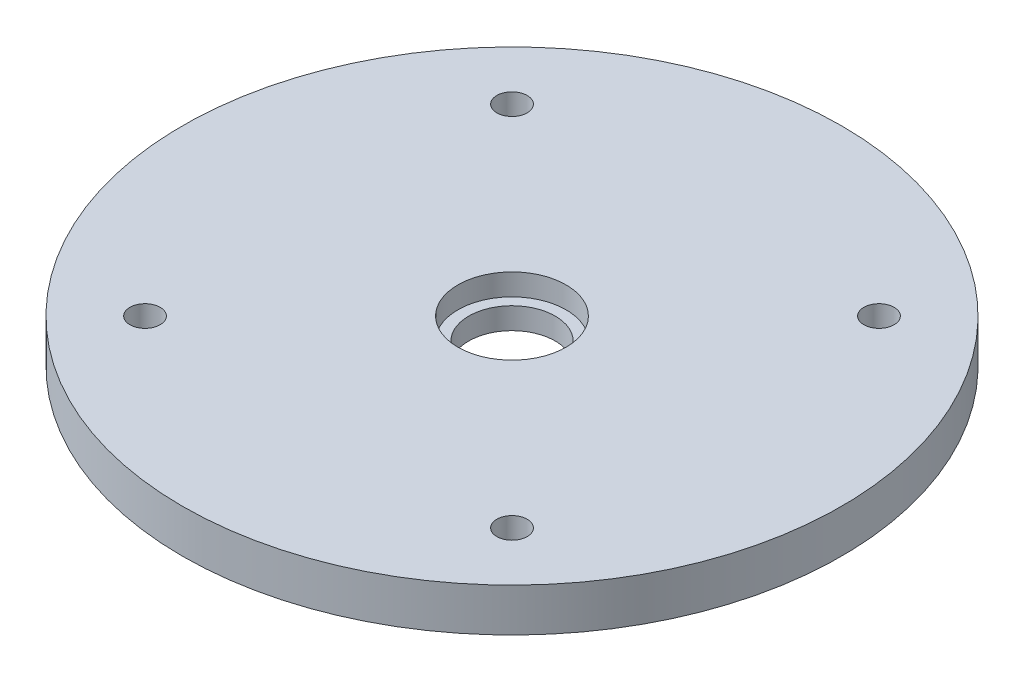
ISO-10303-21;
HEADER;
FILE_DESCRIPTION(('STEP AP214'),'2;1');
FILE_NAME('part.step','',(''),(''),'','','');
FILE_SCHEMA(('AUTOMOTIVE_DESIGN { 1 0 10303 214 1 1 1 1 }'));
ENDSEC;
DATA;
#1=APPLICATION_CONTEXT('core data for automotive mechanical design processes');
#2=APPLICATION_PROTOCOL_DEFINITION('international standard','automotive_design',2000,#1);
#3=PRODUCT_CONTEXT('',#1,'mechanical');
#4=PRODUCT('Part','Part','',(#3));
#5=PRODUCT_RELATED_PRODUCT_CATEGORY('part','',(#4));
#6=PRODUCT_DEFINITION_FORMATION('','',#4);
#7=PRODUCT_DEFINITION_CONTEXT('part definition',#1,'design');
#8=PRODUCT_DEFINITION('design','',#6,#7);
#9=PRODUCT_DEFINITION_SHAPE('','',#8);
#10=(LENGTH_UNIT() NAMED_UNIT(*) SI_UNIT(.MILLI.,.METRE.));
#11=(NAMED_UNIT(*) PLANE_ANGLE_UNIT() SI_UNIT($,.RADIAN.));
#12=(NAMED_UNIT(*) SI_UNIT($,.STERADIAN.) SOLID_ANGLE_UNIT());
#13=UNCERTAINTY_MEASURE_WITH_UNIT(LENGTH_MEASURE(1.E-05),#10,'distance_accuracy_value','');
#14=(GEOMETRIC_REPRESENTATION_CONTEXT(3) GLOBAL_UNCERTAINTY_ASSIGNED_CONTEXT((#13)) GLOBAL_UNIT_ASSIGNED_CONTEXT((#10,
#11,#12)) REPRESENTATION_CONTEXT('',''));
#15=CARTESIAN_POINT('',(0.,0.,0.));
#16=DIRECTION('',(0.,0.,1.));
#17=DIRECTION('',(1.,0.,0.));
#18=AXIS2_PLACEMENT_3D('',#15,#16,#17);
#19=CARTESIAN_POINT('',(0.,5.,0.));
#20=DIRECTION('',(0.,-1.,0.));
#21=DIRECTION('',(0.,0.,-1.));
#22=AXIS2_PLACEMENT_3D('',#19,#20,#21);
#23=CYLINDRICAL_SURFACE('',#22,38.1);
#24=CARTESIAN_POINT('',(0.,5.,0.));
#25=DIRECTION('',(0.,1.,0.));
#26=DIRECTION('',(0.,0.,1.));
#27=AXIS2_PLACEMENT_3D('',#24,#25,#26);
#28=CIRCLE('',#27,38.1);
#29=CARTESIAN_POINT('',(0.,5.,38.1));
#30=VERTEX_POINT('',#29);
#31=EDGE_CURVE('E10',#30,#30,#28,.T.);
#32=ORIENTED_EDGE('',*,*,#31,.F.);
#33=EDGE_LOOP('',(#32));
#34=FACE_BOUND('',#33,.T.);
#35=CARTESIAN_POINT('',(0.,0.,0.));
#36=DIRECTION('',(0.,1.,0.));
#37=DIRECTION('',(0.,0.,1.));
#38=AXIS2_PLACEMENT_3D('',#35,#36,#37);
#39=CIRCLE('',#38,38.1);
#40=CARTESIAN_POINT('',(0.,0.,38.1));
#41=VERTEX_POINT('',#40);
#42=EDGE_CURVE('E40',#41,#41,#39,.T.);
#43=ORIENTED_EDGE('',*,*,#42,.T.);
#44=EDGE_LOOP('',(#43));
#45=FACE_BOUND('',#44,.T.);
#46=ADVANCED_FACE('F33',(#34,#45),#23,.T.);
#47=CARTESIAN_POINT('',(0.,5.,0.));
#48=DIRECTION('',(0.,1.,0.));
#49=DIRECTION('',(0.,0.,1.));
#50=AXIS2_PLACEMENT_3D('',#47,#48,#49);
#51=PLANE('',#50);
#52=CARTESIAN_POINT('',(0.,5.,0.));
#53=DIRECTION('',(0.,1.,0.));
#54=DIRECTION('',(0.,0.,1.));
#55=AXIS2_PLACEMENT_3D('',#52,#53,#54);
#56=CIRCLE('',#55,6.25);
#57=CARTESIAN_POINT('',(0.,5.,6.25));
#58=VERTEX_POINT('',#57);
#59=EDGE_CURVE('E95',#58,#58,#56,.T.);
#60=ORIENTED_EDGE('',*,*,#59,.F.);
#61=EDGE_LOOP('',(#60));
#62=FACE_BOUND('',#61,.T.);
#63=CARTESIAN_POINT('',(21.2132034355965,5.,21.2132034355963));
#64=DIRECTION('',(0.,1.,0.));
#65=DIRECTION('',(0.,0.,1.));
#66=AXIS2_PLACEMENT_3D('',#63,#64,#65);
#67=CIRCLE('',#66,1.75);
#68=CARTESIAN_POINT('',(21.2132034355965,5.,22.9632034355963));
#69=VERTEX_POINT('',#68);
#70=EDGE_CURVE('E53',#69,#69,#67,.T.);
#71=ORIENTED_EDGE('',*,*,#70,.F.);
#72=EDGE_LOOP('',(#71));
#73=FACE_BOUND('',#72,.T.);
#74=CARTESIAN_POINT('',(-21.2132034355964,5.,21.2132034355965));
#75=DIRECTION('',(0.,1.,0.));
#76=DIRECTION('',(0.,0.,1.));
#77=AXIS2_PLACEMENT_3D('',#74,#75,#76);
#78=CIRCLE('',#77,1.75);
#79=CARTESIAN_POINT('',(-21.2132034355964,5.,22.9632034355965));
#80=VERTEX_POINT('',#79);
#81=EDGE_CURVE('E60',#80,#80,#78,.T.);
#82=ORIENTED_EDGE('',*,*,#81,.F.);
#83=EDGE_LOOP('',(#82));
#84=FACE_BOUND('',#83,.T.);
#85=CARTESIAN_POINT('',(-21.2132034355965,5.,-21.2132034355963));
#86=DIRECTION('',(0.,1.,0.));
#87=DIRECTION('',(0.,0.,1.));
#88=AXIS2_PLACEMENT_3D('',#85,#86,#87);
#89=CIRCLE('',#88,1.75);
#90=CARTESIAN_POINT('',(-21.2132034355965,5.,-19.4632034355963));
#91=VERTEX_POINT('',#90);
#92=EDGE_CURVE('E66',#91,#91,#89,.T.);
#93=ORIENTED_EDGE('',*,*,#92,.F.);
#94=EDGE_LOOP('',(#93));
#95=FACE_BOUND('',#94,.T.);
#96=CARTESIAN_POINT('',(21.2132034355964,5.,-21.2132034355965));
#97=DIRECTION('',(0.,1.,0.));
#98=DIRECTION('',(0.,0.,1.));
#99=AXIS2_PLACEMENT_3D('',#96,#97,#98);
#100=CIRCLE('',#99,1.75);
#101=CARTESIAN_POINT('',(21.2132034355964,5.,-19.4632034355965));
#102=VERTEX_POINT('',#101);
#103=EDGE_CURVE('E47',#102,#102,#100,.T.);
#104=ORIENTED_EDGE('',*,*,#103,.F.);
#105=EDGE_LOOP('',(#104));
#106=FACE_BOUND('',#105,.T.);
#107=ORIENTED_EDGE('',*,*,#31,.T.);
#108=EDGE_LOOP('',(#107));
#109=FACE_BOUND('',#108,.T.);
#110=ADVANCED_FACE('F123',(#62,#73,#84,#95,#106,#109),#51,.T.);
#111=CARTESIAN_POINT('',(0.,0.,0.));
#112=DIRECTION('',(0.,1.,0.));
#113=DIRECTION('',(0.,0.,1.));
#114=AXIS2_PLACEMENT_3D('',#111,#112,#113);
#115=PLANE('',#114);
#116=CARTESIAN_POINT('',(0.,0.,0.));
#117=DIRECTION('',(0.,1.,0.));
#118=DIRECTION('',(0.,0.,1.));
#119=AXIS2_PLACEMENT_3D('',#116,#117,#118);
#120=CIRCLE('',#119,5.);
#121=CARTESIAN_POINT('',(0.,0.,5.));
#122=VERTEX_POINT('',#121);
#123=EDGE_CURVE('E100',#122,#122,#120,.T.);
#124=ORIENTED_EDGE('',*,*,#123,.T.);
#125=EDGE_LOOP('',(#124));
#126=FACE_BOUND('',#125,.T.);
#127=CARTESIAN_POINT('',(0.,0.,-33.1));
#128=DIRECTION('',(0.,-1.,0.));
#129=DIRECTION('',(0.,0.,-1.));
#130=AXIS2_PLACEMENT_3D('',#127,#128,#129);
#131=CIRCLE('',#130,2.5);
#132=CARTESIAN_POINT('',(0.,0.,-35.6));
#133=VERTEX_POINT('',#132);
#134=EDGE_CURVE('E90',#133,#133,#131,.T.);
#135=ORIENTED_EDGE('',*,*,#134,.F.);
#136=EDGE_LOOP('',(#135));
#137=FACE_BOUND('',#136,.T.);
#138=CARTESIAN_POINT('',(33.1,0.,0.));
#139=DIRECTION('',(0.,-1.,0.));
#140=DIRECTION('',(0.,0.,-1.));
#141=AXIS2_PLACEMENT_3D('',#138,#139,#140);
#142=CIRCLE('',#141,2.5);
#143=CARTESIAN_POINT('',(33.1,0.,-2.5));
#144=VERTEX_POINT('',#143);
#145=EDGE_CURVE('E84',#144,#144,#142,.T.);
#146=ORIENTED_EDGE('',*,*,#145,.F.);
#147=EDGE_LOOP('',(#146));
#148=FACE_BOUND('',#147,.T.);
#149=CARTESIAN_POINT('',(0.,0.,33.1));
#150=DIRECTION('',(0.,-1.,0.));
#151=DIRECTION('',(0.,0.,-1.));
#152=AXIS2_PLACEMENT_3D('',#149,#150,#151);
#153=CIRCLE('',#152,2.5);
#154=CARTESIAN_POINT('',(0.,0.,30.6));
#155=VERTEX_POINT('',#154);
#156=EDGE_CURVE('E78',#155,#155,#153,.T.);
#157=ORIENTED_EDGE('',*,*,#156,.F.);
#158=EDGE_LOOP('',(#157));
#159=FACE_BOUND('',#158,.T.);
#160=CARTESIAN_POINT('',(-33.1,0.,0.));
#161=DIRECTION('',(0.,-1.,0.));
#162=DIRECTION('',(0.,0.,-1.));
#163=AXIS2_PLACEMENT_3D('',#160,#161,#162);
#164=CIRCLE('',#163,2.5);
#165=CARTESIAN_POINT('',(-33.1,0.,-2.5));
#166=VERTEX_POINT('',#165);
#167=EDGE_CURVE('E71',#166,#166,#164,.T.);
#168=ORIENTED_EDGE('',*,*,#167,.F.);
#169=EDGE_LOOP('',(#168));
#170=FACE_BOUND('',#169,.T.);
#171=ORIENTED_EDGE('',*,*,#42,.F.);
#172=EDGE_LOOP('',(#171));
#173=FACE_BOUND('',#172,.T.);
#174=ADVANCED_FACE('F126',(#126,#137,#148,#159,#170,#173),#115,.F.);
#175=CARTESIAN_POINT('',(21.2132034355964,2.,-21.2132034355965));
#176=DIRECTION('',(0.,1.,0.));
#177=DIRECTION('',(0.,0.,1.));
#178=AXIS2_PLACEMENT_3D('',#175,#176,#177);
#179=CYLINDRICAL_SURFACE('',#178,1.75);
#180=CARTESIAN_POINT('',(21.2132034355964,2.,-21.2132034355965));
#181=DIRECTION('',(0.,1.,0.));
#182=DIRECTION('',(0.,0.,1.));
#183=AXIS2_PLACEMENT_3D('',#180,#181,#182);
#184=CIRCLE('',#183,1.75);
#185=CARTESIAN_POINT('',(21.2132034355964,2.,-19.4632034355965));
#186=VERTEX_POINT('',#185);
#187=EDGE_CURVE('E45',#186,#186,#184,.T.);
#188=ORIENTED_EDGE('',*,*,#187,.F.);
#189=EDGE_LOOP('',(#188));
#190=FACE_BOUND('',#189,.T.);
#191=ORIENTED_EDGE('',*,*,#103,.T.);
#192=EDGE_LOOP('',(#191));
#193=FACE_BOUND('',#192,.T.);
#194=ADVANCED_FACE('F136',(#190,#193),#179,.F.);
#195=CARTESIAN_POINT('',(21.2132034355964,2.,-21.2132034355965));
#196=DIRECTION('',(0.,1.,0.));
#197=DIRECTION('',(0.,0.,1.));
#198=AXIS2_PLACEMENT_3D('',#195,#196,#197);
#199=PLANE('',#198);
#200=ORIENTED_EDGE('',*,*,#187,.T.);
#201=EDGE_LOOP('',(#200));
#202=FACE_BOUND('',#201,.T.);
#203=ADVANCED_FACE('F138',(#202),#199,.T.);
#204=CARTESIAN_POINT('',(-21.2132034355965,2.,-21.2132034355963));
#205=DIRECTION('',(0.,1.,0.));
#206=DIRECTION('',(0.,0.,1.));
#207=AXIS2_PLACEMENT_3D('',#204,#205,#206);
#208=CYLINDRICAL_SURFACE('',#207,1.75);
#209=CARTESIAN_POINT('',(-21.2132034355965,2.,-21.2132034355963));
#210=DIRECTION('',(0.,1.,0.));
#211=DIRECTION('',(0.,0.,1.));
#212=AXIS2_PLACEMENT_3D('',#209,#210,#211);
#213=CIRCLE('',#212,1.75);
#214=CARTESIAN_POINT('',(-21.2132034355965,2.,-19.4632034355963));
#215=VERTEX_POINT('',#214);
#216=EDGE_CURVE('E50',#215,#215,#213,.T.);
#217=ORIENTED_EDGE('',*,*,#216,.F.);
#218=EDGE_LOOP('',(#217));
#219=FACE_BOUND('',#218,.T.);
#220=ORIENTED_EDGE('',*,*,#92,.T.);
#221=EDGE_LOOP('',(#220));
#222=FACE_BOUND('',#221,.T.);
#223=ADVANCED_FACE('F145',(#219,#222),#208,.F.);
#224=CARTESIAN_POINT('',(-21.2132034355965,2.,-21.2132034355963));
#225=DIRECTION('',(0.,1.,0.));
#226=DIRECTION('',(0.,0.,1.));
#227=AXIS2_PLACEMENT_3D('',#224,#225,#226);
#228=PLANE('',#227);
#229=ORIENTED_EDGE('',*,*,#216,.T.);
#230=EDGE_LOOP('',(#229));
#231=FACE_BOUND('',#230,.T.);
#232=ADVANCED_FACE('F220',(#231),#228,.T.);
#233=CARTESIAN_POINT('',(-21.2132034355964,2.,21.2132034355965));
#234=DIRECTION('',(0.,1.,0.));
#235=DIRECTION('',(0.,0.,1.));
#236=AXIS2_PLACEMENT_3D('',#233,#234,#235);
#237=CYLINDRICAL_SURFACE('',#236,1.75);
#238=CARTESIAN_POINT('',(-21.2132034355964,2.,21.2132034355965));
#239=DIRECTION('',(0.,1.,0.));
#240=DIRECTION('',(0.,0.,1.));
#241=AXIS2_PLACEMENT_3D('',#238,#239,#240);
#242=CIRCLE('',#241,1.75);
#243=CARTESIAN_POINT('',(-21.2132034355964,2.,22.9632034355965));
#244=VERTEX_POINT('',#243);
#245=EDGE_CURVE('E63',#244,#244,#242,.T.);
#246=ORIENTED_EDGE('',*,*,#245,.F.);
#247=EDGE_LOOP('',(#246));
#248=FACE_BOUND('',#247,.T.);
#249=ORIENTED_EDGE('',*,*,#81,.T.);
#250=EDGE_LOOP('',(#249));
#251=FACE_BOUND('',#250,.T.);
#252=ADVANCED_FACE('F223',(#248,#251),#237,.F.);
#253=CARTESIAN_POINT('',(-21.2132034355964,2.,21.2132034355965));
#254=DIRECTION('',(0.,1.,0.));
#255=DIRECTION('',(0.,0.,1.));
#256=AXIS2_PLACEMENT_3D('',#253,#254,#255);
#257=PLANE('',#256);
#258=ORIENTED_EDGE('',*,*,#245,.T.);
#259=EDGE_LOOP('',(#258));
#260=FACE_BOUND('',#259,.T.);
#261=ADVANCED_FACE('F228',(#260),#257,.T.);
#262=CARTESIAN_POINT('',(21.2132034355965,2.,21.2132034355963));
#263=DIRECTION('',(0.,1.,0.));
#264=DIRECTION('',(0.,0.,1.));
#265=AXIS2_PLACEMENT_3D('',#262,#263,#264);
#266=CYLINDRICAL_SURFACE('',#265,1.75);
#267=CARTESIAN_POINT('',(21.2132034355965,2.,21.2132034355963));
#268=DIRECTION('',(0.,1.,0.));
#269=DIRECTION('',(0.,0.,1.));
#270=AXIS2_PLACEMENT_3D('',#267,#268,#269);
#271=CIRCLE('',#270,1.75);
#272=CARTESIAN_POINT('',(21.2132034355965,2.,22.9632034355963));
#273=VERTEX_POINT('',#272);
#274=EDGE_CURVE('E56',#273,#273,#271,.T.);
#275=ORIENTED_EDGE('',*,*,#274,.F.);
#276=EDGE_LOOP('',(#275));
#277=FACE_BOUND('',#276,.T.);
#278=ORIENTED_EDGE('',*,*,#70,.T.);
#279=EDGE_LOOP('',(#278));
#280=FACE_BOUND('',#279,.T.);
#281=ADVANCED_FACE('F231',(#277,#280),#266,.F.);
#282=CARTESIAN_POINT('',(21.2132034355965,2.,21.2132034355963));
#283=DIRECTION('',(0.,1.,0.));
#284=DIRECTION('',(0.,0.,1.));
#285=AXIS2_PLACEMENT_3D('',#282,#283,#284);
#286=PLANE('',#285);
#287=ORIENTED_EDGE('',*,*,#274,.T.);
#288=EDGE_LOOP('',(#287));
#289=FACE_BOUND('',#288,.T.);
#290=ADVANCED_FACE('F218',(#289),#286,.T.);
#291=CARTESIAN_POINT('',(-33.1,3.,0.));
#292=DIRECTION('',(0.,-1.,0.));
#293=DIRECTION('',(0.,0.,-1.));
#294=AXIS2_PLACEMENT_3D('',#291,#292,#293);
#295=CYLINDRICAL_SURFACE('',#294,2.5);
#296=CARTESIAN_POINT('',(-33.1,3.,0.));
#297=DIRECTION('',(0.,-1.,0.));
#298=DIRECTION('',(0.,0.,-1.));
#299=AXIS2_PLACEMENT_3D('',#296,#297,#298);
#300=CIRCLE('',#299,2.5);
#301=CARTESIAN_POINT('',(-33.1,3.,-2.5));
#302=VERTEX_POINT('',#301);
#303=EDGE_CURVE('E74',#302,#302,#300,.T.);
#304=ORIENTED_EDGE('',*,*,#303,.F.);
#305=EDGE_LOOP('',(#304));
#306=FACE_BOUND('',#305,.T.);
#307=ORIENTED_EDGE('',*,*,#167,.T.);
#308=EDGE_LOOP('',(#307));
#309=FACE_BOUND('',#308,.T.);
#310=ADVANCED_FACE('F214',(#306,#309),#295,.F.);
#311=CARTESIAN_POINT('',(-33.1,3.,0.));
#312=DIRECTION('',(0.,-1.,0.));
#313=DIRECTION('',(0.,0.,-1.));
#314=AXIS2_PLACEMENT_3D('',#311,#312,#313);
#315=PLANE('',#314);
#316=ORIENTED_EDGE('',*,*,#303,.T.);
#317=EDGE_LOOP('',(#316));
#318=FACE_BOUND('',#317,.T.);
#319=ADVANCED_FACE('F210',(#318),#315,.T.);
#320=CARTESIAN_POINT('',(0.,3.,33.1));
#321=DIRECTION('',(0.,-1.,0.));
#322=DIRECTION('',(0.,0.,-1.));
#323=AXIS2_PLACEMENT_3D('',#320,#321,#322);
#324=CYLINDRICAL_SURFACE('',#323,2.5);
#325=CARTESIAN_POINT('',(0.,3.,33.1));
#326=DIRECTION('',(0.,-1.,0.));
#327=DIRECTION('',(0.,0.,-1.));
#328=AXIS2_PLACEMENT_3D('',#325,#326,#327);
#329=CIRCLE('',#328,2.5);
#330=CARTESIAN_POINT('',(0.,3.,30.6));
#331=VERTEX_POINT('',#330);
#332=EDGE_CURVE('E81',#331,#331,#329,.T.);
#333=ORIENTED_EDGE('',*,*,#332,.F.);
#334=EDGE_LOOP('',(#333));
#335=FACE_BOUND('',#334,.T.);
#336=ORIENTED_EDGE('',*,*,#156,.T.);
#337=EDGE_LOOP('',(#336));
#338=FACE_BOUND('',#337,.T.);
#339=ADVANCED_FACE('F206',(#335,#338),#324,.F.);
#340=CARTESIAN_POINT('',(0.,3.,33.1));
#341=DIRECTION('',(0.,-1.,0.));
#342=DIRECTION('',(0.,0.,-1.));
#343=AXIS2_PLACEMENT_3D('',#340,#341,#342);
#344=PLANE('',#343);
#345=ORIENTED_EDGE('',*,*,#332,.T.);
#346=EDGE_LOOP('',(#345));
#347=FACE_BOUND('',#346,.T.);
#348=ADVANCED_FACE('F202',(#347),#344,.T.);
#349=CARTESIAN_POINT('',(33.1,3.,0.));
#350=DIRECTION('',(0.,-1.,0.));
#351=DIRECTION('',(0.,0.,-1.));
#352=AXIS2_PLACEMENT_3D('',#349,#350,#351);
#353=CYLINDRICAL_SURFACE('',#352,2.5);
#354=CARTESIAN_POINT('',(33.1,3.,0.));
#355=DIRECTION('',(0.,-1.,0.));
#356=DIRECTION('',(0.,0.,-1.));
#357=AXIS2_PLACEMENT_3D('',#354,#355,#356);
#358=CIRCLE('',#357,2.5);
#359=CARTESIAN_POINT('',(33.1,3.,-2.5));
#360=VERTEX_POINT('',#359);
#361=EDGE_CURVE('E87',#360,#360,#358,.T.);
#362=ORIENTED_EDGE('',*,*,#361,.F.);
#363=EDGE_LOOP('',(#362));
#364=FACE_BOUND('',#363,.T.);
#365=ORIENTED_EDGE('',*,*,#145,.T.);
#366=EDGE_LOOP('',(#365));
#367=FACE_BOUND('',#366,.T.);
#368=ADVANCED_FACE('F198',(#364,#367),#353,.F.);
#369=CARTESIAN_POINT('',(33.1,3.,0.));
#370=DIRECTION('',(0.,-1.,0.));
#371=DIRECTION('',(0.,0.,-1.));
#372=AXIS2_PLACEMENT_3D('',#369,#370,#371);
#373=PLANE('',#372);
#374=ORIENTED_EDGE('',*,*,#361,.T.);
#375=EDGE_LOOP('',(#374));
#376=FACE_BOUND('',#375,.T.);
#377=ADVANCED_FACE('F194',(#376),#373,.T.);
#378=CARTESIAN_POINT('',(0.,3.,-33.1));
#379=DIRECTION('',(0.,-1.,0.));
#380=DIRECTION('',(0.,0.,-1.));
#381=AXIS2_PLACEMENT_3D('',#378,#379,#380);
#382=CYLINDRICAL_SURFACE('',#381,2.5);
#383=CARTESIAN_POINT('',(0.,3.,-33.1));
#384=DIRECTION('',(0.,-1.,0.));
#385=DIRECTION('',(0.,0.,-1.));
#386=AXIS2_PLACEMENT_3D('',#383,#384,#385);
#387=CIRCLE('',#386,2.5);
#388=CARTESIAN_POINT('',(0.,3.,-35.6));
#389=VERTEX_POINT('',#388);
#390=EDGE_CURVE('E57',#389,#389,#387,.T.);
#391=ORIENTED_EDGE('',*,*,#390,.F.);
#392=EDGE_LOOP('',(#391));
#393=FACE_BOUND('',#392,.T.);
#394=ORIENTED_EDGE('',*,*,#134,.T.);
#395=EDGE_LOOP('',(#394));
#396=FACE_BOUND('',#395,.T.);
#397=ADVANCED_FACE('F190',(#393,#396),#382,.F.);
#398=CARTESIAN_POINT('',(0.,3.,-33.1));
#399=DIRECTION('',(0.,-1.,0.));
#400=DIRECTION('',(0.,0.,-1.));
#401=AXIS2_PLACEMENT_3D('',#398,#399,#400);
#402=PLANE('',#401);
#403=ORIENTED_EDGE('',*,*,#390,.T.);
#404=EDGE_LOOP('',(#403));
#405=FACE_BOUND('',#404,.T.);
#406=ADVANCED_FACE('F119',(#405),#402,.T.);
#407=CARTESIAN_POINT('',(0.,2.5,0.));
#408=DIRECTION('',(0.,1.,0.));
#409=DIRECTION('',(0.,0.,1.));
#410=AXIS2_PLACEMENT_3D('',#407,#408,#409);
#411=CYLINDRICAL_SURFACE('',#410,6.25);
#412=CARTESIAN_POINT('',(0.,2.5,0.));
#413=DIRECTION('',(0.,1.,0.));
#414=DIRECTION('',(0.,0.,1.));
#415=AXIS2_PLACEMENT_3D('',#412,#413,#414);
#416=CIRCLE('',#415,6.25);
#417=CARTESIAN_POINT('',(0.,2.5,6.25));
#418=VERTEX_POINT('',#417);
#419=EDGE_CURVE('E75',#418,#418,#416,.T.);
#420=ORIENTED_EDGE('',*,*,#419,.F.);
#421=EDGE_LOOP('',(#420));
#422=FACE_BOUND('',#421,.T.);
#423=ORIENTED_EDGE('',*,*,#59,.T.);
#424=EDGE_LOOP('',(#423));
#425=FACE_BOUND('',#424,.T.);
#426=ADVANCED_FACE('F113',(#422,#425),#411,.F.);
#427=CARTESIAN_POINT('',(0.,2.5,0.));
#428=DIRECTION('',(0.,1.,0.));
#429=DIRECTION('',(0.,0.,1.));
#430=AXIS2_PLACEMENT_3D('',#427,#428,#429);
#431=PLANE('',#430);
#432=CARTESIAN_POINT('',(0.,2.5,0.));
#433=DIRECTION('',(0.,1.,0.));
#434=DIRECTION('',(0.,0.,1.));
#435=AXIS2_PLACEMENT_3D('',#432,#433,#434);
#436=CIRCLE('',#435,5.);
#437=CARTESIAN_POINT('',(0.,2.5,5.));
#438=VERTEX_POINT('',#437);
#439=EDGE_CURVE('E36',#438,#438,#436,.T.);
#440=ORIENTED_EDGE('',*,*,#439,.F.);
#441=EDGE_LOOP('',(#440));
#442=FACE_BOUND('',#441,.T.);
#443=ORIENTED_EDGE('',*,*,#419,.T.);
#444=EDGE_LOOP('',(#443));
#445=FACE_BOUND('',#444,.T.);
#446=ADVANCED_FACE('F110',(#442,#445),#431,.T.);
#447=CARTESIAN_POINT('',(0.,0.,0.));
#448=DIRECTION('',(0.,1.,0.));
#449=DIRECTION('',(0.,0.,1.));
#450=AXIS2_PLACEMENT_3D('',#447,#448,#449);
#451=CYLINDRICAL_SURFACE('',#450,5.);
#452=ORIENTED_EDGE('',*,*,#439,.T.);
#453=EDGE_LOOP('',(#452));
#454=FACE_BOUND('',#453,.T.);
#455=ORIENTED_EDGE('',*,*,#123,.F.);
#456=EDGE_LOOP('',(#455));
#457=FACE_BOUND('',#456,.T.);
#458=ADVANCED_FACE('F107',(#454,#457),#451,.F.);
#459=CLOSED_SHELL('',(#46,#110,#174,#194,#203,#223,#232,#252,#261,#281,#290,#310,#319,#339,#348,
#368,#377,#397,#406,#426,#446,#458));
#460=MANIFOLD_SOLID_BREP('B2',#459);
#461=ADVANCED_BREP_SHAPE_REPRESENTATION('',(#18,#460),#14);
#462=SHAPE_DEFINITION_REPRESENTATION(#9,#461);
ENDSEC;
END-ISO-10303-21;
